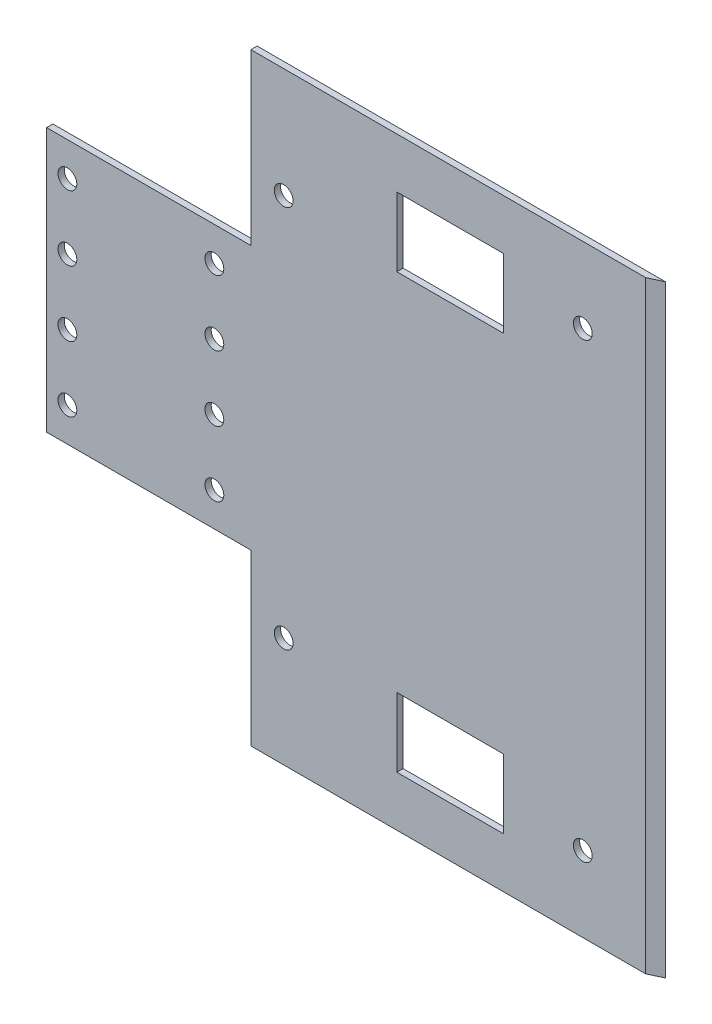
ISO-10303-21;
HEADER;
FILE_DESCRIPTION(('STEP AP214'),'2;1');
FILE_NAME('part.step','',(''),(''),'','','');
FILE_SCHEMA(('AUTOMOTIVE_DESIGN { 1 0 10303 214 1 1 1 1 }'));
ENDSEC;
DATA;
#1=APPLICATION_CONTEXT('core data for automotive mechanical design processes');
#2=APPLICATION_PROTOCOL_DEFINITION('international standard','automotive_design',2000,#1);
#3=PRODUCT_CONTEXT('',#1,'mechanical');
#4=PRODUCT('Part','Part','',(#3));
#5=PRODUCT_RELATED_PRODUCT_CATEGORY('part','',(#4));
#6=PRODUCT_DEFINITION_FORMATION('','',#4);
#7=PRODUCT_DEFINITION_CONTEXT('part definition',#1,'design');
#8=PRODUCT_DEFINITION('design','',#6,#7);
#9=PRODUCT_DEFINITION_SHAPE('','',#8);
#10=(LENGTH_UNIT() NAMED_UNIT(*) SI_UNIT(.MILLI.,.METRE.));
#11=(NAMED_UNIT(*) PLANE_ANGLE_UNIT() SI_UNIT($,.RADIAN.));
#12=(NAMED_UNIT(*) SI_UNIT($,.STERADIAN.) SOLID_ANGLE_UNIT());
#13=UNCERTAINTY_MEASURE_WITH_UNIT(LENGTH_MEASURE(1.E-05),#10,'distance_accuracy_value','');
#14=(GEOMETRIC_REPRESENTATION_CONTEXT(3) GLOBAL_UNCERTAINTY_ASSIGNED_CONTEXT((#13)) GLOBAL_UNIT_ASSIGNED_CONTEXT((#10,
#11,#12)) REPRESENTATION_CONTEXT('',''));
#15=CARTESIAN_POINT('',(0.,0.,0.));
#16=DIRECTION('',(0.,0.,1.));
#17=DIRECTION('',(1.,0.,0.));
#18=AXIS2_PLACEMENT_3D('',#15,#16,#17);
#19=CARTESIAN_POINT('',(0.,0.,1.));
#20=DIRECTION('',(0.,0.,1.));
#21=DIRECTION('',(1.,0.,0.));
#22=AXIS2_PLACEMENT_3D('',#19,#20,#21);
#23=PLANE('',#22);
#24=DIRECTION('',(0.,1.,0.));
#25=VECTOR('',#24,1.);
#26=CARTESIAN_POINT('',(47.8554930794905,-48.,0.999999999999999));
#27=LINE('',#26,#25);
#28=CARTESIAN_POINT('',(47.8554930794905,-48.,0.999999999999999));
#29=VERTEX_POINT('',#28);
#30=CARTESIAN_POINT('',(47.8554930794905,48.,0.999999999999999));
#31=VERTEX_POINT('',#30);
#32=EDGE_CURVE('E154',#29,#31,#27,.T.);
#33=ORIENTED_EDGE('',*,*,#32,.T.);
#34=DIRECTION('',(-1.,0.,0.));
#35=VECTOR('',#34,1.);
#36=CARTESIAN_POINT('',(50.,48.,1.));
#37=LINE('',#36,#35);
#38=CARTESIAN_POINT('',(-15.,48.,1.));
#39=VERTEX_POINT('',#38);
#40=EDGE_CURVE('E212',#31,#39,#37,.T.);
#41=ORIENTED_EDGE('',*,*,#40,.T.);
#42=DIRECTION('',(0.,-1.,0.));
#43=VECTOR('',#42,1.);
#44=CARTESIAN_POINT('',(-15.,48.,1.));
#45=LINE('',#44,#43);
#46=CARTESIAN_POINT('',(-15.,21.,1.));
#47=VERTEX_POINT('',#46);
#48=EDGE_CURVE('E210',#39,#47,#45,.T.);
#49=ORIENTED_EDGE('',*,*,#48,.T.);
#50=DIRECTION('',(-1.,0.,0.));
#51=VECTOR('',#50,1.);
#52=CARTESIAN_POINT('',(-15.,21.,1.));
#53=LINE('',#52,#51);
#54=CARTESIAN_POINT('',(-47.5,21.,1.));
#55=VERTEX_POINT('',#54);
#56=EDGE_CURVE('E189',#47,#55,#53,.T.);
#57=ORIENTED_EDGE('',*,*,#56,.T.);
#58=DIRECTION('',(0.,-1.,0.));
#59=VECTOR('',#58,1.);
#60=CARTESIAN_POINT('',(-47.5,21.,1.));
#61=LINE('',#60,#59);
#62=CARTESIAN_POINT('',(-47.5,-21.,1.));
#63=VERTEX_POINT('',#62);
#64=EDGE_CURVE('E184',#55,#63,#61,.T.);
#65=ORIENTED_EDGE('',*,*,#64,.T.);
#66=DIRECTION('',(1.,0.,0.));
#67=VECTOR('',#66,1.);
#68=CARTESIAN_POINT('',(-47.5,-21.,1.));
#69=LINE('',#68,#67);
#70=CARTESIAN_POINT('',(-15.,-21.,1.));
#71=VERTEX_POINT('',#70);
#72=EDGE_CURVE('E217',#63,#71,#69,.T.);
#73=ORIENTED_EDGE('',*,*,#72,.T.);
#74=DIRECTION('',(0.,-1.,0.));
#75=VECTOR('',#74,1.);
#76=CARTESIAN_POINT('',(-15.,-21.,1.));
#77=LINE('',#76,#75);
#78=CARTESIAN_POINT('',(-15.,-48.,1.));
#79=VERTEX_POINT('',#78);
#80=EDGE_CURVE('E200',#71,#79,#77,.T.);
#81=ORIENTED_EDGE('',*,*,#80,.T.);
#82=DIRECTION('',(1.,0.,0.));
#83=VECTOR('',#82,1.);
#84=CARTESIAN_POINT('',(-15.,-48.,1.));
#85=LINE('',#84,#83);
#86=EDGE_CURVE('E214',#79,#29,#85,.T.);
#87=ORIENTED_EDGE('',*,*,#86,.T.);
#88=EDGE_LOOP('',(#33,#41,#49,#57,#65,#73,#81,#87));
#89=FACE_BOUND('',#88,.T.);
#90=CARTESIAN_POINT('',(37.8554930794904,36.,1.));
#91=DIRECTION('',(0.,0.,1.));
#92=DIRECTION('',(1.,0.,0.));
#93=AXIS2_PLACEMENT_3D('',#90,#91,#92);
#94=CIRCLE('',#93,1.5);
#95=CARTESIAN_POINT('',(39.3554930794904,36.,1.));
#96=VERTEX_POINT('',#95);
#97=EDGE_CURVE('E334',#96,#96,#94,.T.);
#98=ORIENTED_EDGE('',*,*,#97,.F.);
#99=EDGE_LOOP('',(#98));
#100=FACE_BOUND('',#99,.T.);
#101=CARTESIAN_POINT('',(-9.76329768896709,30.5,1.));
#102=DIRECTION('',(0.,0.,1.));
#103=DIRECTION('',(1.,0.,0.));
#104=AXIS2_PLACEMENT_3D('',#101,#102,#103);
#105=CIRCLE('',#104,1.5);
#106=CARTESIAN_POINT('',(-8.26329768896708,30.5,1.));
#107=VERTEX_POINT('',#106);
#108=EDGE_CURVE('E322',#107,#107,#105,.T.);
#109=ORIENTED_EDGE('',*,*,#108,.F.);
#110=EDGE_LOOP('',(#109));
#111=FACE_BOUND('',#110,.T.);
#112=CARTESIAN_POINT('',(-44.2,-5.2,1.));
#113=DIRECTION('',(0.,0.,1.));
#114=DIRECTION('',(1.,0.,0.));
#115=AXIS2_PLACEMENT_3D('',#112,#113,#114);
#116=CIRCLE('',#115,1.5);
#117=CARTESIAN_POINT('',(-42.7,-5.2,1.));
#118=VERTEX_POINT('',#117);
#119=EDGE_CURVE('E310',#118,#118,#116,.T.);
#120=ORIENTED_EDGE('',*,*,#119,.F.);
#121=EDGE_LOOP('',(#120));
#122=FACE_BOUND('',#121,.T.);
#123=DIRECTION('',(-1.,0.,0.));
#124=VECTOR('',#123,1.);
#125=CARTESIAN_POINT('',(25.2514309907959,40.,1.));
#126=LINE('',#125,#124);
#127=CARTESIAN_POINT('',(25.2514309907959,40.,1.));
#128=VERTEX_POINT('',#127);
#129=CARTESIAN_POINT('',(8.25143099079593,40.,1.));
#130=VERTEX_POINT('',#129);
#131=EDGE_CURVE('E304',#128,#130,#126,.T.);
#132=ORIENTED_EDGE('',*,*,#131,.F.);
#133=DIRECTION('',(0.,1.,0.));
#134=VECTOR('',#133,1.);
#135=CARTESIAN_POINT('',(25.2514309907959,29.,1.));
#136=LINE('',#135,#134);
#137=CARTESIAN_POINT('',(25.2514309907959,29.,1.));
#138=VERTEX_POINT('',#137);
#139=EDGE_CURVE('E292',#138,#128,#136,.T.);
#140=ORIENTED_EDGE('',*,*,#139,.F.);
#141=DIRECTION('',(1.,0.,0.));
#142=VECTOR('',#141,1.);
#143=CARTESIAN_POINT('',(25.2514309907959,29.,1.));
#144=LINE('',#143,#142);
#145=CARTESIAN_POINT('',(8.25143099079593,29.,1.));
#146=VERTEX_POINT('',#145);
#147=EDGE_CURVE('E288',#146,#138,#144,.T.);
#148=ORIENTED_EDGE('',*,*,#147,.F.);
#149=DIRECTION('',(0.,-1.,0.));
#150=VECTOR('',#149,1.);
#151=CARTESIAN_POINT('',(8.25143099079593,29.,1.));
#152=LINE('',#151,#150);
#153=EDGE_CURVE('E302',#130,#146,#152,.T.);
#154=ORIENTED_EDGE('',*,*,#153,.F.);
#155=EDGE_LOOP('',(#132,#140,#148,#154));
#156=FACE_BOUND('',#155,.T.);
#157=CARTESIAN_POINT('',(-44.2,15.6,1.));
#158=DIRECTION('',(0.,0.,1.));
#159=DIRECTION('',(1.,0.,0.));
#160=AXIS2_PLACEMENT_3D('',#157,#158,#159);
#161=CIRCLE('',#160,1.5);
#162=CARTESIAN_POINT('',(-42.7,15.6,1.));
#163=VERTEX_POINT('',#162);
#164=EDGE_CURVE('E268',#163,#163,#161,.T.);
#165=ORIENTED_EDGE('',*,*,#164,.F.);
#166=EDGE_LOOP('',(#165));
#167=FACE_BOUND('',#166,.T.);
#168=CARTESIAN_POINT('',(-20.8,-5.20000000000001,1.));
#169=DIRECTION('',(0.,0.,1.));
#170=DIRECTION('',(1.,0.,0.));
#171=AXIS2_PLACEMENT_3D('',#168,#169,#170);
#172=CIRCLE('',#171,1.5);
#173=CARTESIAN_POINT('',(-19.3,-5.20000000000001,1.));
#174=VERTEX_POINT('',#173);
#175=EDGE_CURVE('E230',#174,#174,#172,.T.);
#176=ORIENTED_EDGE('',*,*,#175,.F.);
#177=EDGE_LOOP('',(#176));
#178=FACE_BOUND('',#177,.T.);
#179=CARTESIAN_POINT('',(-20.8,15.6,1.));
#180=DIRECTION('',(0.,0.,1.));
#181=DIRECTION('',(1.,0.,0.));
#182=AXIS2_PLACEMENT_3D('',#179,#180,#181);
#183=CIRCLE('',#182,1.5);
#184=CARTESIAN_POINT('',(-19.3,15.6,1.));
#185=VERTEX_POINT('',#184);
#186=EDGE_CURVE('E208',#185,#185,#183,.T.);
#187=ORIENTED_EDGE('',*,*,#186,.F.);
#188=EDGE_LOOP('',(#187));
#189=FACE_BOUND('',#188,.T.);
#190=CARTESIAN_POINT('',(-20.8,5.19999999999999,1.));
#191=DIRECTION('',(0.,0.,1.));
#192=DIRECTION('',(1.,0.,0.));
#193=AXIS2_PLACEMENT_3D('',#190,#191,#192);
#194=CIRCLE('',#193,1.5);
#195=CARTESIAN_POINT('',(-19.3,5.19999999999999,1.));
#196=VERTEX_POINT('',#195);
#197=EDGE_CURVE('E224',#196,#196,#194,.T.);
#198=ORIENTED_EDGE('',*,*,#197,.F.);
#199=EDGE_LOOP('',(#198));
#200=FACE_BOUND('',#199,.T.);
#201=CARTESIAN_POINT('',(-20.8,-15.6,1.));
#202=DIRECTION('',(0.,0.,1.));
#203=DIRECTION('',(1.,0.,0.));
#204=AXIS2_PLACEMENT_3D('',#201,#202,#203);
#205=CIRCLE('',#204,1.5);
#206=CARTESIAN_POINT('',(-19.3,-15.6,1.));
#207=VERTEX_POINT('',#206);
#208=EDGE_CURVE('E236',#207,#207,#205,.T.);
#209=ORIENTED_EDGE('',*,*,#208,.F.);
#210=EDGE_LOOP('',(#209));
#211=FACE_BOUND('',#210,.T.);
#212=DIRECTION('',(-1.,0.,0.));
#213=VECTOR('',#212,1.);
#214=CARTESIAN_POINT('',(25.2514309907959,-29.,1.));
#215=LINE('',#214,#213);
#216=CARTESIAN_POINT('',(25.2514309907959,-29.,1.));
#217=VERTEX_POINT('',#216);
#218=CARTESIAN_POINT('',(8.25143099079593,-29.,1.));
#219=VERTEX_POINT('',#218);
#220=EDGE_CURVE('E273',#217,#219,#215,.T.);
#221=ORIENTED_EDGE('',*,*,#220,.F.);
#222=DIRECTION('',(0.,1.,0.));
#223=VECTOR('',#222,1.);
#224=CARTESIAN_POINT('',(25.2514309907959,-40.,1.));
#225=LINE('',#224,#223);
#226=CARTESIAN_POINT('',(25.2514309907959,-40.,1.));
#227=VERTEX_POINT('',#226);
#228=EDGE_CURVE('E258',#227,#217,#225,.T.);
#229=ORIENTED_EDGE('',*,*,#228,.F.);
#230=DIRECTION('',(1.,0.,0.));
#231=VECTOR('',#230,1.);
#232=CARTESIAN_POINT('',(25.2514309907959,-40.,1.));
#233=LINE('',#232,#231);
#234=CARTESIAN_POINT('',(8.25143099079593,-40.,1.));
#235=VERTEX_POINT('',#234);
#236=EDGE_CURVE('E254',#235,#227,#233,.T.);
#237=ORIENTED_EDGE('',*,*,#236,.F.);
#238=DIRECTION('',(0.,-1.,0.));
#239=VECTOR('',#238,1.);
#240=CARTESIAN_POINT('',(8.25143099079593,-40.,1.));
#241=LINE('',#240,#239);
#242=EDGE_CURVE('E270',#219,#235,#241,.T.);
#243=ORIENTED_EDGE('',*,*,#242,.F.);
#244=EDGE_LOOP('',(#221,#229,#237,#243));
#245=FACE_BOUND('',#244,.T.);
#246=CARTESIAN_POINT('',(-44.2,5.2,1.));
#247=DIRECTION('',(0.,0.,1.));
#248=DIRECTION('',(1.,0.,0.));
#249=AXIS2_PLACEMENT_3D('',#246,#247,#248);
#250=CIRCLE('',#249,1.5);
#251=CARTESIAN_POINT('',(-42.7,5.2,1.));
#252=VERTEX_POINT('',#251);
#253=EDGE_CURVE('E300',#252,#252,#250,.T.);
#254=ORIENTED_EDGE('',*,*,#253,.F.);
#255=EDGE_LOOP('',(#254));
#256=FACE_BOUND('',#255,.T.);
#257=CARTESIAN_POINT('',(-44.2,-15.6,1.));
#258=DIRECTION('',(0.,0.,1.));
#259=DIRECTION('',(1.,0.,0.));
#260=AXIS2_PLACEMENT_3D('',#257,#258,#259);
#261=CIRCLE('',#260,1.5);
#262=CARTESIAN_POINT('',(-42.7,-15.6,1.));
#263=VERTEX_POINT('',#262);
#264=EDGE_CURVE('E316',#263,#263,#261,.T.);
#265=ORIENTED_EDGE('',*,*,#264,.F.);
#266=EDGE_LOOP('',(#265));
#267=FACE_BOUND('',#266,.T.);
#268=CARTESIAN_POINT('',(-9.76329768896707,-30.5,1.));
#269=DIRECTION('',(0.,0.,1.));
#270=DIRECTION('',(1.,0.,0.));
#271=AXIS2_PLACEMENT_3D('',#268,#269,#270);
#272=CIRCLE('',#271,1.5);
#273=CARTESIAN_POINT('',(-8.26329768896706,-30.5,1.));
#274=VERTEX_POINT('',#273);
#275=EDGE_CURVE('E328',#274,#274,#272,.T.);
#276=ORIENTED_EDGE('',*,*,#275,.F.);
#277=EDGE_LOOP('',(#276));
#278=FACE_BOUND('',#277,.T.);
#279=CARTESIAN_POINT('',(37.8554930794904,-36.,1.));
#280=DIRECTION('',(0.,0.,1.));
#281=DIRECTION('',(1.,0.,0.));
#282=AXIS2_PLACEMENT_3D('',#279,#280,#281);
#283=CIRCLE('',#282,1.5);
#284=CARTESIAN_POINT('',(39.3554930794904,-36.,1.));
#285=VERTEX_POINT('',#284);
#286=EDGE_CURVE('E340',#285,#285,#283,.T.);
#287=ORIENTED_EDGE('',*,*,#286,.F.);
#288=EDGE_LOOP('',(#287));
#289=FACE_BOUND('',#288,.T.);
#290=ADVANCED_FACE('F33',(#89,#100,#111,#122,#156,#167,#178,#189,#200,#211,#245,#256,#267,#278,
#289),#23,.T.);
#291=CARTESIAN_POINT('',(0.,0.,0.));
#292=DIRECTION('',(0.,0.,1.));
#293=DIRECTION('',(1.,0.,0.));
#294=AXIS2_PLACEMENT_3D('',#291,#292,#293);
#295=PLANE('',#294);
#296=CARTESIAN_POINT('',(-44.2,15.6,0.));
#297=DIRECTION('',(0.,0.,1.));
#298=DIRECTION('',(1.,0.,0.));
#299=AXIS2_PLACEMENT_3D('',#296,#297,#298);
#300=CIRCLE('',#299,1.5);
#301=CARTESIAN_POINT('',(-42.7,15.6,0.));
#302=VERTEX_POINT('',#301);
#303=EDGE_CURVE('E276',#302,#302,#300,.T.);
#304=ORIENTED_EDGE('',*,*,#303,.T.);
#305=EDGE_LOOP('',(#304));
#306=FACE_BOUND('',#305,.T.);
#307=DIRECTION('',(0.,1.,0.));
#308=VECTOR('',#307,1.);
#309=CARTESIAN_POINT('',(25.2514309907959,-40.,0.));
#310=LINE('',#309,#308);
#311=CARTESIAN_POINT('',(25.2514309907959,-40.,0.));
#312=VERTEX_POINT('',#311);
#313=CARTESIAN_POINT('',(25.2514309907959,-29.,0.));
#314=VERTEX_POINT('',#313);
#315=EDGE_CURVE('E265',#312,#314,#310,.T.);
#316=ORIENTED_EDGE('',*,*,#315,.T.);
#317=DIRECTION('',(-1.,0.,0.));
#318=VECTOR('',#317,1.);
#319=CARTESIAN_POINT('',(25.2514309907959,-29.,0.));
#320=LINE('',#319,#318);
#321=CARTESIAN_POINT('',(8.25143099079593,-29.,0.));
#322=VERTEX_POINT('',#321);
#323=EDGE_CURVE('E262',#314,#322,#320,.T.);
#324=ORIENTED_EDGE('',*,*,#323,.T.);
#325=DIRECTION('',(0.,-1.,0.));
#326=VECTOR('',#325,1.);
#327=CARTESIAN_POINT('',(8.25143099079593,-40.,0.));
#328=LINE('',#327,#326);
#329=CARTESIAN_POINT('',(8.25143099079593,-40.,0.));
#330=VERTEX_POINT('',#329);
#331=EDGE_CURVE('E259',#322,#330,#328,.T.);
#332=ORIENTED_EDGE('',*,*,#331,.T.);
#333=DIRECTION('',(1.,0.,0.));
#334=VECTOR('',#333,1.);
#335=CARTESIAN_POINT('',(25.2514309907959,-40.,0.));
#336=LINE('',#335,#334);
#337=EDGE_CURVE('E255',#330,#312,#336,.T.);
#338=ORIENTED_EDGE('',*,*,#337,.T.);
#339=EDGE_LOOP('',(#316,#324,#332,#338));
#340=FACE_BOUND('',#339,.T.);
#341=DIRECTION('',(0.,-1.,0.));
#342=VECTOR('',#341,1.);
#343=CARTESIAN_POINT('',(-47.5,21.,0.));
#344=LINE('',#343,#342);
#345=CARTESIAN_POINT('',(-47.5,21.,0.));
#346=VERTEX_POINT('',#345);
#347=CARTESIAN_POINT('',(-47.5,-21.,0.));
#348=VERTEX_POINT('',#347);
#349=EDGE_CURVE('E203',#346,#348,#344,.T.);
#350=ORIENTED_EDGE('',*,*,#349,.F.);
#351=DIRECTION('',(-1.,0.,0.));
#352=VECTOR('',#351,1.);
#353=CARTESIAN_POINT('',(-15.,21.,0.));
#354=LINE('',#353,#352);
#355=CARTESIAN_POINT('',(-15.,21.,0.));
#356=VERTEX_POINT('',#355);
#357=EDGE_CURVE('E182',#356,#346,#354,.T.);
#358=ORIENTED_EDGE('',*,*,#357,.F.);
#359=DIRECTION('',(0.,-1.,0.));
#360=VECTOR('',#359,1.);
#361=CARTESIAN_POINT('',(-15.,48.,0.));
#362=LINE('',#361,#360);
#363=CARTESIAN_POINT('',(-15.,48.,0.));
#364=VERTEX_POINT('',#363);
#365=EDGE_CURVE('E177',#364,#356,#362,.T.);
#366=ORIENTED_EDGE('',*,*,#365,.F.);
#367=DIRECTION('',(-1.,0.,0.));
#368=VECTOR('',#367,1.);
#369=CARTESIAN_POINT('',(50.,48.,0.));
#370=LINE('',#369,#368);
#371=CARTESIAN_POINT('',(50.,48.,0.));
#372=VERTEX_POINT('',#371);
#373=EDGE_CURVE('E175',#372,#364,#370,.T.);
#374=ORIENTED_EDGE('',*,*,#373,.F.);
#375=DIRECTION('',(0.,1.,0.));
#376=VECTOR('',#375,1.);
#377=CARTESIAN_POINT('',(50.,-48.,0.));
#378=LINE('',#377,#376);
#379=CARTESIAN_POINT('',(50.,-48.,0.));
#380=VERTEX_POINT('',#379);
#381=EDGE_CURVE('E151',#380,#372,#378,.T.);
#382=ORIENTED_EDGE('',*,*,#381,.F.);
#383=DIRECTION('',(1.,0.,0.));
#384=VECTOR('',#383,1.);
#385=CARTESIAN_POINT('',(-15.,-48.,0.));
#386=LINE('',#385,#384);
#387=CARTESIAN_POINT('',(-15.,-48.,0.));
#388=VERTEX_POINT('',#387);
#389=EDGE_CURVE('E162',#388,#380,#386,.T.);
#390=ORIENTED_EDGE('',*,*,#389,.F.);
#391=DIRECTION('',(0.,-1.,0.));
#392=VECTOR('',#391,1.);
#393=CARTESIAN_POINT('',(-15.,-21.,0.));
#394=LINE('',#393,#392);
#395=CARTESIAN_POINT('',(-15.,-21.,0.));
#396=VERTEX_POINT('',#395);
#397=EDGE_CURVE('E168',#396,#388,#394,.T.);
#398=ORIENTED_EDGE('',*,*,#397,.F.);
#399=DIRECTION('',(1.,0.,0.));
#400=VECTOR('',#399,1.);
#401=CARTESIAN_POINT('',(-47.5,-21.,0.));
#402=LINE('',#401,#400);
#403=EDGE_CURVE('E202',#348,#396,#402,.T.);
#404=ORIENTED_EDGE('',*,*,#403,.F.);
#405=EDGE_LOOP('',(#350,#358,#366,#374,#382,#390,#398,#404));
#406=FACE_BOUND('',#405,.T.);
#407=CARTESIAN_POINT('',(-20.8,15.6,0.));
#408=DIRECTION('',(0.,0.,1.));
#409=DIRECTION('',(1.,0.,0.));
#410=AXIS2_PLACEMENT_3D('',#407,#408,#409);
#411=CIRCLE('',#410,1.5);
#412=CARTESIAN_POINT('',(-19.3,15.6,0.));
#413=VERTEX_POINT('',#412);
#414=EDGE_CURVE('E221',#413,#413,#411,.T.);
#415=ORIENTED_EDGE('',*,*,#414,.T.);
#416=EDGE_LOOP('',(#415));
#417=FACE_BOUND('',#416,.T.);
#418=CARTESIAN_POINT('',(-20.8,5.19999999999999,0.));
#419=DIRECTION('',(0.,0.,1.));
#420=DIRECTION('',(1.,0.,0.));
#421=AXIS2_PLACEMENT_3D('',#418,#419,#420);
#422=CIRCLE('',#421,1.5);
#423=CARTESIAN_POINT('',(-19.3,5.19999999999999,0.));
#424=VERTEX_POINT('',#423);
#425=EDGE_CURVE('E227',#424,#424,#422,.T.);
#426=ORIENTED_EDGE('',*,*,#425,.T.);
#427=EDGE_LOOP('',(#426));
#428=FACE_BOUND('',#427,.T.);
#429=CARTESIAN_POINT('',(-20.8,-5.20000000000001,0.));
#430=DIRECTION('',(0.,0.,1.));
#431=DIRECTION('',(1.,0.,0.));
#432=AXIS2_PLACEMENT_3D('',#429,#430,#431);
#433=CIRCLE('',#432,1.5);
#434=CARTESIAN_POINT('',(-19.3,-5.20000000000001,0.));
#435=VERTEX_POINT('',#434);
#436=EDGE_CURVE('E233',#435,#435,#433,.T.);
#437=ORIENTED_EDGE('',*,*,#436,.T.);
#438=EDGE_LOOP('',(#437));
#439=FACE_BOUND('',#438,.T.);
#440=CARTESIAN_POINT('',(-20.8,-15.6,0.));
#441=DIRECTION('',(0.,0.,1.));
#442=DIRECTION('',(1.,0.,0.));
#443=AXIS2_PLACEMENT_3D('',#440,#441,#442);
#444=CIRCLE('',#443,1.5);
#445=CARTESIAN_POINT('',(-19.3,-15.6,0.));
#446=VERTEX_POINT('',#445);
#447=EDGE_CURVE('E239',#446,#446,#444,.T.);
#448=ORIENTED_EDGE('',*,*,#447,.T.);
#449=EDGE_LOOP('',(#448));
#450=FACE_BOUND('',#449,.T.);
#451=DIRECTION('',(0.,1.,0.));
#452=VECTOR('',#451,1.);
#453=CARTESIAN_POINT('',(25.2514309907959,29.,0.));
#454=LINE('',#453,#452);
#455=CARTESIAN_POINT('',(25.2514309907959,29.,0.));
#456=VERTEX_POINT('',#455);
#457=CARTESIAN_POINT('',(25.2514309907959,40.,0.));
#458=VERTEX_POINT('',#457);
#459=EDGE_CURVE('E56',#456,#458,#454,.T.);
#460=ORIENTED_EDGE('',*,*,#459,.T.);
#461=DIRECTION('',(-1.,0.,0.));
#462=VECTOR('',#461,1.);
#463=CARTESIAN_POINT('',(25.2514309907959,40.,0.));
#464=LINE('',#463,#462);
#465=CARTESIAN_POINT('',(8.25143099079593,40.,0.));
#466=VERTEX_POINT('',#465);
#467=EDGE_CURVE('E296',#458,#466,#464,.T.);
#468=ORIENTED_EDGE('',*,*,#467,.T.);
#469=DIRECTION('',(0.,-1.,0.));
#470=VECTOR('',#469,1.);
#471=CARTESIAN_POINT('',(8.25143099079593,29.,0.));
#472=LINE('',#471,#470);
#473=CARTESIAN_POINT('',(8.25143099079593,29.,0.));
#474=VERTEX_POINT('',#473);
#475=EDGE_CURVE('E293',#466,#474,#472,.T.);
#476=ORIENTED_EDGE('',*,*,#475,.T.);
#477=DIRECTION('',(1.,0.,0.));
#478=VECTOR('',#477,1.);
#479=CARTESIAN_POINT('',(25.2514309907959,29.,0.));
#480=LINE('',#479,#478);
#481=EDGE_CURVE('E289',#474,#456,#480,.T.);
#482=ORIENTED_EDGE('',*,*,#481,.T.);
#483=EDGE_LOOP('',(#460,#468,#476,#482));
#484=FACE_BOUND('',#483,.T.);
#485=CARTESIAN_POINT('',(-44.2,5.2,0.));
#486=DIRECTION('',(0.,0.,1.));
#487=DIRECTION('',(1.,0.,0.));
#488=AXIS2_PLACEMENT_3D('',#485,#486,#487);
#489=CIRCLE('',#488,1.5);
#490=CARTESIAN_POINT('',(-42.7,5.2,0.));
#491=VERTEX_POINT('',#490);
#492=EDGE_CURVE('E307',#491,#491,#489,.T.);
#493=ORIENTED_EDGE('',*,*,#492,.T.);
#494=EDGE_LOOP('',(#493));
#495=FACE_BOUND('',#494,.T.);
#496=CARTESIAN_POINT('',(-44.2,-5.2,0.));
#497=DIRECTION('',(0.,0.,1.));
#498=DIRECTION('',(1.,0.,0.));
#499=AXIS2_PLACEMENT_3D('',#496,#497,#498);
#500=CIRCLE('',#499,1.5);
#501=CARTESIAN_POINT('',(-42.7,-5.2,0.));
#502=VERTEX_POINT('',#501);
#503=EDGE_CURVE('E313',#502,#502,#500,.T.);
#504=ORIENTED_EDGE('',*,*,#503,.T.);
#505=EDGE_LOOP('',(#504));
#506=FACE_BOUND('',#505,.T.);
#507=CARTESIAN_POINT('',(-44.2,-15.6,0.));
#508=DIRECTION('',(0.,0.,1.));
#509=DIRECTION('',(1.,0.,0.));
#510=AXIS2_PLACEMENT_3D('',#507,#508,#509);
#511=CIRCLE('',#510,1.5);
#512=CARTESIAN_POINT('',(-42.7,-15.6,0.));
#513=VERTEX_POINT('',#512);
#514=EDGE_CURVE('E319',#513,#513,#511,.T.);
#515=ORIENTED_EDGE('',*,*,#514,.T.);
#516=EDGE_LOOP('',(#515));
#517=FACE_BOUND('',#516,.T.);
#518=CARTESIAN_POINT('',(-9.76329768896709,30.5,0.));
#519=DIRECTION('',(0.,0.,1.));
#520=DIRECTION('',(1.,0.,0.));
#521=AXIS2_PLACEMENT_3D('',#518,#519,#520);
#522=CIRCLE('',#521,1.5);
#523=CARTESIAN_POINT('',(-8.26329768896708,30.5,0.));
#524=VERTEX_POINT('',#523);
#525=EDGE_CURVE('E325',#524,#524,#522,.T.);
#526=ORIENTED_EDGE('',*,*,#525,.T.);
#527=EDGE_LOOP('',(#526));
#528=FACE_BOUND('',#527,.T.);
#529=CARTESIAN_POINT('',(-9.76329768896707,-30.5,0.));
#530=DIRECTION('',(0.,0.,1.));
#531=DIRECTION('',(1.,0.,0.));
#532=AXIS2_PLACEMENT_3D('',#529,#530,#531);
#533=CIRCLE('',#532,1.5);
#534=CARTESIAN_POINT('',(-8.26329768896706,-30.5,0.));
#535=VERTEX_POINT('',#534);
#536=EDGE_CURVE('E331',#535,#535,#533,.T.);
#537=ORIENTED_EDGE('',*,*,#536,.T.);
#538=EDGE_LOOP('',(#537));
#539=FACE_BOUND('',#538,.T.);
#540=CARTESIAN_POINT('',(37.8554930794904,36.,0.));
#541=DIRECTION('',(0.,0.,1.));
#542=DIRECTION('',(1.,0.,0.));
#543=AXIS2_PLACEMENT_3D('',#540,#541,#542);
#544=CIRCLE('',#543,1.5);
#545=CARTESIAN_POINT('',(39.3554930794904,36.,0.));
#546=VERTEX_POINT('',#545);
#547=EDGE_CURVE('E337',#546,#546,#544,.T.);
#548=ORIENTED_EDGE('',*,*,#547,.T.);
#549=EDGE_LOOP('',(#548));
#550=FACE_BOUND('',#549,.T.);
#551=CARTESIAN_POINT('',(37.8554930794904,-36.,0.));
#552=DIRECTION('',(0.,0.,1.));
#553=DIRECTION('',(1.,0.,0.));
#554=AXIS2_PLACEMENT_3D('',#551,#552,#553);
#555=CIRCLE('',#554,1.5);
#556=CARTESIAN_POINT('',(39.3554930794904,-36.,0.));
#557=VERTEX_POINT('',#556);
#558=EDGE_CURVE('E343',#557,#557,#555,.T.);
#559=ORIENTED_EDGE('',*,*,#558,.T.);
#560=EDGE_LOOP('',(#559));
#561=FACE_BOUND('',#560,.T.);
#562=ADVANCED_FACE('F172',(#306,#340,#406,#417,#428,#439,#450,#484,#495,#506,#517,#528,#539,
#550,#561),#295,.F.);
#563=CARTESIAN_POINT('',(-47.5,21.,1.));
#564=DIRECTION('',(1.,0.,0.));
#565=DIRECTION('',(0.,0.,-1.));
#566=AXIS2_PLACEMENT_3D('',#563,#564,#565);
#567=PLANE('',#566);
#568=ORIENTED_EDGE('',*,*,#349,.T.);
#569=DIRECTION('',(0.,0.,-1.));
#570=VECTOR('',#569,1.);
#571=CARTESIAN_POINT('',(-47.5,-21.,1.));
#572=LINE('',#571,#570);
#573=EDGE_CURVE('E11',#63,#348,#572,.T.);
#574=ORIENTED_EDGE('',*,*,#573,.F.);
#575=ORIENTED_EDGE('',*,*,#64,.F.);
#576=DIRECTION('',(0.,0.,-1.));
#577=VECTOR('',#576,1.);
#578=CARTESIAN_POINT('',(-47.5,21.,1.));
#579=LINE('',#578,#577);
#580=EDGE_CURVE('E185',#55,#346,#579,.T.);
#581=ORIENTED_EDGE('',*,*,#580,.T.);
#582=EDGE_LOOP('',(#568,#574,#575,#581));
#583=FACE_BOUND('',#582,.T.);
#584=ADVANCED_FACE('F35',(#583),#567,.F.);
#585=CARTESIAN_POINT('',(-47.5,-21.,1.));
#586=DIRECTION('',(0.,1.,0.));
#587=DIRECTION('',(0.,0.,1.));
#588=AXIS2_PLACEMENT_3D('',#585,#586,#587);
#589=PLANE('',#588);
#590=ORIENTED_EDGE('',*,*,#403,.T.);
#591=DIRECTION('',(0.,0.,-1.));
#592=VECTOR('',#591,1.);
#593=CARTESIAN_POINT('',(-15.,-21.,1.));
#594=LINE('',#593,#592);
#595=EDGE_CURVE('E41',#71,#396,#594,.T.);
#596=ORIENTED_EDGE('',*,*,#595,.F.);
#597=ORIENTED_EDGE('',*,*,#72,.F.);
#598=ORIENTED_EDGE('',*,*,#573,.T.);
#599=EDGE_LOOP('',(#590,#596,#597,#598));
#600=FACE_BOUND('',#599,.T.);
#601=ADVANCED_FACE('F367',(#600),#589,.F.);
#602=CARTESIAN_POINT('',(-15.,-21.,1.));
#603=DIRECTION('',(1.,0.,0.));
#604=DIRECTION('',(0.,0.,-1.));
#605=AXIS2_PLACEMENT_3D('',#602,#603,#604);
#606=PLANE('',#605);
#607=ORIENTED_EDGE('',*,*,#397,.T.);
#608=DIRECTION('',(0.,0.,-1.));
#609=VECTOR('',#608,1.);
#610=CARTESIAN_POINT('',(-15.,-48.,1.));
#611=LINE('',#610,#609);
#612=EDGE_CURVE('E165',#79,#388,#611,.T.);
#613=ORIENTED_EDGE('',*,*,#612,.F.);
#614=ORIENTED_EDGE('',*,*,#80,.F.);
#615=ORIENTED_EDGE('',*,*,#595,.T.);
#616=EDGE_LOOP('',(#607,#613,#614,#615));
#617=FACE_BOUND('',#616,.T.);
#618=ADVANCED_FACE('F199',(#617),#606,.F.);
#619=CARTESIAN_POINT('',(-15.,-48.,1.));
#620=DIRECTION('',(0.,1.,0.));
#621=DIRECTION('',(0.,0.,1.));
#622=AXIS2_PLACEMENT_3D('',#619,#620,#621);
#623=PLANE('',#622);
#624=ORIENTED_EDGE('',*,*,#389,.T.);
#625=DIRECTION('',(-0.906307787036649,0.,0.422618261740701));
#626=VECTOR('',#625,1.);
#627=CARTESIAN_POINT('',(47.8554930794905,-48.,0.999999999999999));
#628=LINE('',#627,#626);
#629=EDGE_CURVE('E147',#380,#29,#628,.T.);
#630=ORIENTED_EDGE('',*,*,#629,.T.);
#631=ORIENTED_EDGE('',*,*,#86,.F.);
#632=ORIENTED_EDGE('',*,*,#612,.T.);
#633=EDGE_LOOP('',(#624,#630,#631,#632));
#634=FACE_BOUND('',#633,.T.);
#635=ADVANCED_FACE('F163',(#634),#623,.F.);
#636=CARTESIAN_POINT('',(50.,48.,1.));
#637=DIRECTION('',(0.,-1.,0.));
#638=DIRECTION('',(0.,0.,-1.));
#639=AXIS2_PLACEMENT_3D('',#636,#637,#638);
#640=PLANE('',#639);
#641=ORIENTED_EDGE('',*,*,#40,.F.);
#642=DIRECTION('',(-0.906307787036649,0.,0.422618261740701));
#643=VECTOR('',#642,1.);
#644=CARTESIAN_POINT('',(47.8554930794905,48.,0.999999999999999));
#645=LINE('',#644,#643);
#646=EDGE_CURVE('E158',#372,#31,#645,.T.);
#647=ORIENTED_EDGE('',*,*,#646,.F.);
#648=ORIENTED_EDGE('',*,*,#373,.T.);
#649=DIRECTION('',(0.,0.,-1.));
#650=VECTOR('',#649,1.);
#651=CARTESIAN_POINT('',(-15.,48.,1.));
#652=LINE('',#651,#650);
#653=EDGE_CURVE('E192',#39,#364,#652,.T.);
#654=ORIENTED_EDGE('',*,*,#653,.F.);
#655=EDGE_LOOP('',(#641,#647,#648,#654));
#656=FACE_BOUND('',#655,.T.);
#657=ADVANCED_FACE('F354',(#656),#640,.F.);
#658=CARTESIAN_POINT('',(-15.,48.,1.));
#659=DIRECTION('',(1.,0.,0.));
#660=DIRECTION('',(0.,1.,0.));
#661=AXIS2_PLACEMENT_3D('',#658,#659,#660);
#662=PLANE('',#661);
#663=ORIENTED_EDGE('',*,*,#365,.T.);
#664=DIRECTION('',(0.,0.,-1.));
#665=VECTOR('',#664,1.);
#666=CARTESIAN_POINT('',(-15.,21.,1.));
#667=LINE('',#666,#665);
#668=EDGE_CURVE('E188',#47,#356,#667,.T.);
#669=ORIENTED_EDGE('',*,*,#668,.F.);
#670=ORIENTED_EDGE('',*,*,#48,.F.);
#671=ORIENTED_EDGE('',*,*,#653,.T.);
#672=EDGE_LOOP('',(#663,#669,#670,#671));
#673=FACE_BOUND('',#672,.T.);
#674=ADVANCED_FACE('F358',(#673),#662,.F.);
#675=CARTESIAN_POINT('',(-15.,21.,1.));
#676=DIRECTION('',(0.,-1.,0.));
#677=DIRECTION('',(1.,0.,0.));
#678=AXIS2_PLACEMENT_3D('',#675,#676,#677);
#679=PLANE('',#678);
#680=ORIENTED_EDGE('',*,*,#357,.T.);
#681=ORIENTED_EDGE('',*,*,#580,.F.);
#682=ORIENTED_EDGE('',*,*,#56,.F.);
#683=ORIENTED_EDGE('',*,*,#668,.T.);
#684=EDGE_LOOP('',(#680,#681,#682,#683));
#685=FACE_BOUND('',#684,.T.);
#686=ADVANCED_FACE('F364',(#685),#679,.F.);
#687=CARTESIAN_POINT('',(-20.8,15.6,1.));
#688=DIRECTION('',(0.,0.,-1.));
#689=DIRECTION('',(-1.,0.,0.));
#690=AXIS2_PLACEMENT_3D('',#687,#688,#689);
#691=CYLINDRICAL_SURFACE('',#690,1.5);
#692=ORIENTED_EDGE('',*,*,#186,.T.);
#693=EDGE_LOOP('',(#692));
#694=FACE_BOUND('',#693,.T.);
#695=ORIENTED_EDGE('',*,*,#414,.F.);
#696=EDGE_LOOP('',(#695));
#697=FACE_BOUND('',#696,.T.);
#698=ADVANCED_FACE('F382',(#694,#697),#691,.F.);
#699=CARTESIAN_POINT('',(-20.8,5.19999999999999,1.));
#700=DIRECTION('',(0.,0.,-1.));
#701=DIRECTION('',(-1.,0.,0.));
#702=AXIS2_PLACEMENT_3D('',#699,#700,#701);
#703=CYLINDRICAL_SURFACE('',#702,1.5);
#704=ORIENTED_EDGE('',*,*,#197,.T.);
#705=EDGE_LOOP('',(#704));
#706=FACE_BOUND('',#705,.T.);
#707=ORIENTED_EDGE('',*,*,#425,.F.);
#708=EDGE_LOOP('',(#707));
#709=FACE_BOUND('',#708,.T.);
#710=ADVANCED_FACE('F416',(#706,#709),#703,.F.);
#711=CARTESIAN_POINT('',(-20.8,-5.20000000000001,1.));
#712=DIRECTION('',(0.,0.,-1.));
#713=DIRECTION('',(-1.,0.,0.));
#714=AXIS2_PLACEMENT_3D('',#711,#712,#713);
#715=CYLINDRICAL_SURFACE('',#714,1.5);
#716=ORIENTED_EDGE('',*,*,#175,.T.);
#717=EDGE_LOOP('',(#716));
#718=FACE_BOUND('',#717,.T.);
#719=ORIENTED_EDGE('',*,*,#436,.F.);
#720=EDGE_LOOP('',(#719));
#721=FACE_BOUND('',#720,.T.);
#722=ADVANCED_FACE('F423',(#718,#721),#715,.F.);
#723=CARTESIAN_POINT('',(-20.8,-15.6,1.));
#724=DIRECTION('',(0.,0.,-1.));
#725=DIRECTION('',(-1.,0.,0.));
#726=AXIS2_PLACEMENT_3D('',#723,#724,#725);
#727=CYLINDRICAL_SURFACE('',#726,1.5);
#728=ORIENTED_EDGE('',*,*,#208,.T.);
#729=EDGE_LOOP('',(#728));
#730=FACE_BOUND('',#729,.T.);
#731=ORIENTED_EDGE('',*,*,#447,.F.);
#732=EDGE_LOOP('',(#731));
#733=FACE_BOUND('',#732,.T.);
#734=ADVANCED_FACE('F430',(#730,#733),#727,.F.);
#735=CARTESIAN_POINT('',(25.2514309907959,-40.,1.));
#736=DIRECTION('',(-1.,0.,0.));
#737=DIRECTION('',(0.,0.,1.));
#738=AXIS2_PLACEMENT_3D('',#735,#736,#737);
#739=PLANE('',#738);
#740=ORIENTED_EDGE('',*,*,#315,.F.);
#741=DIRECTION('',(0.,0.,-1.));
#742=VECTOR('',#741,1.);
#743=CARTESIAN_POINT('',(25.2514309907959,-40.,1.));
#744=LINE('',#743,#742);
#745=EDGE_CURVE('E251',#227,#312,#744,.T.);
#746=ORIENTED_EDGE('',*,*,#745,.F.);
#747=ORIENTED_EDGE('',*,*,#228,.T.);
#748=DIRECTION('',(0.,0.,-1.));
#749=VECTOR('',#748,1.);
#750=CARTESIAN_POINT('',(25.2514309907959,-29.,1.));
#751=LINE('',#750,#749);
#752=EDGE_CURVE('E242',#217,#314,#751,.T.);
#753=ORIENTED_EDGE('',*,*,#752,.T.);
#754=EDGE_LOOP('',(#740,#746,#747,#753));
#755=FACE_BOUND('',#754,.T.);
#756=ADVANCED_FACE('F438',(#755),#739,.T.);
#757=CARTESIAN_POINT('',(25.2514309907959,-29.,1.));
#758=DIRECTION('',(0.,-1.,0.));
#759=DIRECTION('',(0.,0.,-1.));
#760=AXIS2_PLACEMENT_3D('',#757,#758,#759);
#761=PLANE('',#760);
#762=ORIENTED_EDGE('',*,*,#323,.F.);
#763=ORIENTED_EDGE('',*,*,#752,.F.);
#764=ORIENTED_EDGE('',*,*,#220,.T.);
#765=DIRECTION('',(0.,0.,-1.));
#766=VECTOR('',#765,1.);
#767=CARTESIAN_POINT('',(8.25143099079593,-29.,1.));
#768=LINE('',#767,#766);
#769=EDGE_CURVE('E247',#219,#322,#768,.T.);
#770=ORIENTED_EDGE('',*,*,#769,.T.);
#771=EDGE_LOOP('',(#762,#763,#764,#770));
#772=FACE_BOUND('',#771,.T.);
#773=ADVANCED_FACE('F446',(#772),#761,.T.);
#774=CARTESIAN_POINT('',(8.25143099079593,-40.,1.));
#775=DIRECTION('',(1.,0.,0.));
#776=DIRECTION('',(0.,0.,-1.));
#777=AXIS2_PLACEMENT_3D('',#774,#775,#776);
#778=PLANE('',#777);
#779=ORIENTED_EDGE('',*,*,#331,.F.);
#780=ORIENTED_EDGE('',*,*,#769,.F.);
#781=ORIENTED_EDGE('',*,*,#242,.T.);
#782=DIRECTION('',(0.,0.,-1.));
#783=VECTOR('',#782,1.);
#784=CARTESIAN_POINT('',(8.25143099079593,-40.,1.));
#785=LINE('',#784,#783);
#786=EDGE_CURVE('E249',#235,#330,#785,.T.);
#787=ORIENTED_EDGE('',*,*,#786,.T.);
#788=EDGE_LOOP('',(#779,#780,#781,#787));
#789=FACE_BOUND('',#788,.T.);
#790=ADVANCED_FACE('F454',(#789),#778,.T.);
#791=CARTESIAN_POINT('',(25.2514309907959,-40.,1.));
#792=DIRECTION('',(0.,1.,0.));
#793=DIRECTION('',(0.,0.,1.));
#794=AXIS2_PLACEMENT_3D('',#791,#792,#793);
#795=PLANE('',#794);
#796=ORIENTED_EDGE('',*,*,#337,.F.);
#797=ORIENTED_EDGE('',*,*,#786,.F.);
#798=ORIENTED_EDGE('',*,*,#236,.T.);
#799=ORIENTED_EDGE('',*,*,#745,.T.);
#800=EDGE_LOOP('',(#796,#797,#798,#799));
#801=FACE_BOUND('',#800,.T.);
#802=ADVANCED_FACE('F462',(#801),#795,.T.);
#803=CARTESIAN_POINT('',(-44.2,15.6,1.));
#804=DIRECTION('',(0.,0.,-1.));
#805=DIRECTION('',(-1.,0.,0.));
#806=AXIS2_PLACEMENT_3D('',#803,#804,#805);
#807=CYLINDRICAL_SURFACE('',#806,1.5);
#808=ORIENTED_EDGE('',*,*,#164,.T.);
#809=EDGE_LOOP('',(#808));
#810=FACE_BOUND('',#809,.T.);
#811=ORIENTED_EDGE('',*,*,#303,.F.);
#812=EDGE_LOOP('',(#811));
#813=FACE_BOUND('',#812,.T.);
#814=ADVANCED_FACE('F470',(#810,#813),#807,.F.);
#815=CARTESIAN_POINT('',(25.2514309907959,29.,1.));
#816=DIRECTION('',(-1.,0.,0.));
#817=DIRECTION('',(0.,0.,1.));
#818=AXIS2_PLACEMENT_3D('',#815,#816,#817);
#819=PLANE('',#818);
#820=ORIENTED_EDGE('',*,*,#459,.F.);
#821=DIRECTION('',(0.,0.,-1.));
#822=VECTOR('',#821,1.);
#823=CARTESIAN_POINT('',(25.2514309907959,29.,1.));
#824=LINE('',#823,#822);
#825=EDGE_CURVE('E286',#138,#456,#824,.T.);
#826=ORIENTED_EDGE('',*,*,#825,.F.);
#827=ORIENTED_EDGE('',*,*,#139,.T.);
#828=DIRECTION('',(0.,0.,-1.));
#829=VECTOR('',#828,1.);
#830=CARTESIAN_POINT('',(25.2514309907959,40.,1.));
#831=LINE('',#830,#829);
#832=EDGE_CURVE('E279',#128,#458,#831,.T.);
#833=ORIENTED_EDGE('',*,*,#832,.T.);
#834=EDGE_LOOP('',(#820,#826,#827,#833));
#835=FACE_BOUND('',#834,.T.);
#836=ADVANCED_FACE('F478',(#835),#819,.T.);
#837=CARTESIAN_POINT('',(25.2514309907959,40.,1.));
#838=DIRECTION('',(0.,-1.,0.));
#839=DIRECTION('',(0.,0.,-1.));
#840=AXIS2_PLACEMENT_3D('',#837,#838,#839);
#841=PLANE('',#840);
#842=ORIENTED_EDGE('',*,*,#467,.F.);
#843=ORIENTED_EDGE('',*,*,#832,.F.);
#844=ORIENTED_EDGE('',*,*,#131,.T.);
#845=DIRECTION('',(0.,0.,-1.));
#846=VECTOR('',#845,1.);
#847=CARTESIAN_POINT('',(8.25143099079593,40.,1.));
#848=LINE('',#847,#846);
#849=EDGE_CURVE('E283',#130,#466,#848,.T.);
#850=ORIENTED_EDGE('',*,*,#849,.T.);
#851=EDGE_LOOP('',(#842,#843,#844,#850));
#852=FACE_BOUND('',#851,.T.);
#853=ADVANCED_FACE('F486',(#852),#841,.T.);
#854=CARTESIAN_POINT('',(8.25143099079593,29.,1.));
#855=DIRECTION('',(1.,0.,0.));
#856=DIRECTION('',(0.,0.,-1.));
#857=AXIS2_PLACEMENT_3D('',#854,#855,#856);
#858=PLANE('',#857);
#859=ORIENTED_EDGE('',*,*,#475,.F.);
#860=ORIENTED_EDGE('',*,*,#849,.F.);
#861=ORIENTED_EDGE('',*,*,#153,.T.);
#862=DIRECTION('',(0.,0.,-1.));
#863=VECTOR('',#862,1.);
#864=CARTESIAN_POINT('',(8.25143099079593,29.,1.));
#865=LINE('',#864,#863);
#866=EDGE_CURVE('E48',#146,#474,#865,.T.);
#867=ORIENTED_EDGE('',*,*,#866,.T.);
#868=EDGE_LOOP('',(#859,#860,#861,#867));
#869=FACE_BOUND('',#868,.T.);
#870=ADVANCED_FACE('F493',(#869),#858,.T.);
#871=CARTESIAN_POINT('',(25.2514309907959,29.,1.));
#872=DIRECTION('',(0.,1.,0.));
#873=DIRECTION('',(0.,0.,1.));
#874=AXIS2_PLACEMENT_3D('',#871,#872,#873);
#875=PLANE('',#874);
#876=ORIENTED_EDGE('',*,*,#481,.F.);
#877=ORIENTED_EDGE('',*,*,#866,.F.);
#878=ORIENTED_EDGE('',*,*,#147,.T.);
#879=ORIENTED_EDGE('',*,*,#825,.T.);
#880=EDGE_LOOP('',(#876,#877,#878,#879));
#881=FACE_BOUND('',#880,.T.);
#882=ADVANCED_FACE('F501',(#881),#875,.T.);
#883=CARTESIAN_POINT('',(-44.2,5.2,1.));
#884=DIRECTION('',(0.,0.,-1.));
#885=DIRECTION('',(-1.,0.,0.));
#886=AXIS2_PLACEMENT_3D('',#883,#884,#885);
#887=CYLINDRICAL_SURFACE('',#886,1.5);
#888=ORIENTED_EDGE('',*,*,#253,.T.);
#889=EDGE_LOOP('',(#888));
#890=FACE_BOUND('',#889,.T.);
#891=ORIENTED_EDGE('',*,*,#492,.F.);
#892=EDGE_LOOP('',(#891));
#893=FACE_BOUND('',#892,.T.);
#894=ADVANCED_FACE('F509',(#890,#893),#887,.F.);
#895=CARTESIAN_POINT('',(-44.2,-5.2,1.));
#896=DIRECTION('',(0.,0.,-1.));
#897=DIRECTION('',(-1.,0.,0.));
#898=AXIS2_PLACEMENT_3D('',#895,#896,#897);
#899=CYLINDRICAL_SURFACE('',#898,1.5);
#900=ORIENTED_EDGE('',*,*,#119,.T.);
#901=EDGE_LOOP('',(#900));
#902=FACE_BOUND('',#901,.T.);
#903=ORIENTED_EDGE('',*,*,#503,.F.);
#904=EDGE_LOOP('',(#903));
#905=FACE_BOUND('',#904,.T.);
#906=ADVANCED_FACE('F516',(#902,#905),#899,.F.);
#907=CARTESIAN_POINT('',(-44.2,-15.6,1.));
#908=DIRECTION('',(0.,0.,-1.));
#909=DIRECTION('',(-1.,0.,0.));
#910=AXIS2_PLACEMENT_3D('',#907,#908,#909);
#911=CYLINDRICAL_SURFACE('',#910,1.5);
#912=ORIENTED_EDGE('',*,*,#264,.T.);
#913=EDGE_LOOP('',(#912));
#914=FACE_BOUND('',#913,.T.);
#915=ORIENTED_EDGE('',*,*,#514,.F.);
#916=EDGE_LOOP('',(#915));
#917=FACE_BOUND('',#916,.T.);
#918=ADVANCED_FACE('F524',(#914,#917),#911,.F.);
#919=CARTESIAN_POINT('',(-9.76329768896709,30.5,1.));
#920=DIRECTION('',(0.,0.,-1.));
#921=DIRECTION('',(-1.,0.,0.));
#922=AXIS2_PLACEMENT_3D('',#919,#920,#921);
#923=CYLINDRICAL_SURFACE('',#922,1.5);
#924=ORIENTED_EDGE('',*,*,#108,.T.);
#925=EDGE_LOOP('',(#924));
#926=FACE_BOUND('',#925,.T.);
#927=ORIENTED_EDGE('',*,*,#525,.F.);
#928=EDGE_LOOP('',(#927));
#929=FACE_BOUND('',#928,.T.);
#930=ADVANCED_FACE('F532',(#926,#929),#923,.F.);
#931=CARTESIAN_POINT('',(-9.76329768896707,-30.5,1.));
#932=DIRECTION('',(0.,0.,-1.));
#933=DIRECTION('',(-1.,0.,0.));
#934=AXIS2_PLACEMENT_3D('',#931,#932,#933);
#935=CYLINDRICAL_SURFACE('',#934,1.5);
#936=ORIENTED_EDGE('',*,*,#275,.T.);
#937=EDGE_LOOP('',(#936));
#938=FACE_BOUND('',#937,.T.);
#939=ORIENTED_EDGE('',*,*,#536,.F.);
#940=EDGE_LOOP('',(#939));
#941=FACE_BOUND('',#940,.T.);
#942=ADVANCED_FACE('F540',(#938,#941),#935,.F.);
#943=CARTESIAN_POINT('',(37.8554930794904,36.,1.));
#944=DIRECTION('',(0.,0.,-1.));
#945=DIRECTION('',(-1.,0.,0.));
#946=AXIS2_PLACEMENT_3D('',#943,#944,#945);
#947=CYLINDRICAL_SURFACE('',#946,1.5);
#948=ORIENTED_EDGE('',*,*,#97,.T.);
#949=EDGE_LOOP('',(#948));
#950=FACE_BOUND('',#949,.T.);
#951=ORIENTED_EDGE('',*,*,#547,.F.);
#952=EDGE_LOOP('',(#951));
#953=FACE_BOUND('',#952,.T.);
#954=ADVANCED_FACE('F548',(#950,#953),#947,.F.);
#955=CARTESIAN_POINT('',(37.8554930794904,-36.,1.));
#956=DIRECTION('',(0.,0.,-1.));
#957=DIRECTION('',(-1.,0.,0.));
#958=AXIS2_PLACEMENT_3D('',#955,#956,#957);
#959=CYLINDRICAL_SURFACE('',#958,1.5);
#960=ORIENTED_EDGE('',*,*,#286,.T.);
#961=EDGE_LOOP('',(#960));
#962=FACE_BOUND('',#961,.T.);
#963=ORIENTED_EDGE('',*,*,#558,.F.);
#964=EDGE_LOOP('',(#963));
#965=FACE_BOUND('',#964,.T.);
#966=ADVANCED_FACE('F556',(#962,#965),#959,.F.);
#967=CARTESIAN_POINT('',(47.8554930794905,-48.,0.999999999999999));
#968=DIRECTION('',(-0.422618261740701,0.,-0.906307787036649));
#969=DIRECTION('',(-0.906307787036649,0.,0.422618261740701));
#970=AXIS2_PLACEMENT_3D('',#967,#968,#969);
#971=PLANE('',#970);
#972=ORIENTED_EDGE('',*,*,#646,.T.);
#973=ORIENTED_EDGE('',*,*,#32,.F.);
#974=ORIENTED_EDGE('',*,*,#629,.F.);
#975=ORIENTED_EDGE('',*,*,#381,.T.);
#976=EDGE_LOOP('',(#972,#973,#974,#975));
#977=FACE_BOUND('',#976,.T.);
#978=ADVANCED_FACE('F149',(#977),#971,.F.);
#979=CLOSED_SHELL('',(#290,#562,#584,#601,#618,#635,#657,#674,#686,#698,#710,#722,#734,#756,
#773,#790,#802,#814,#836,#853,#870,#882,#894,#906,#918,#930,#942,#954,#966,#978));
#980=MANIFOLD_SOLID_BREP('B2',#979);
#981=ADVANCED_BREP_SHAPE_REPRESENTATION('',(#18,#980),#14);
#982=SHAPE_DEFINITION_REPRESENTATION(#9,#981);
ENDSEC;
END-ISO-10303-21;
